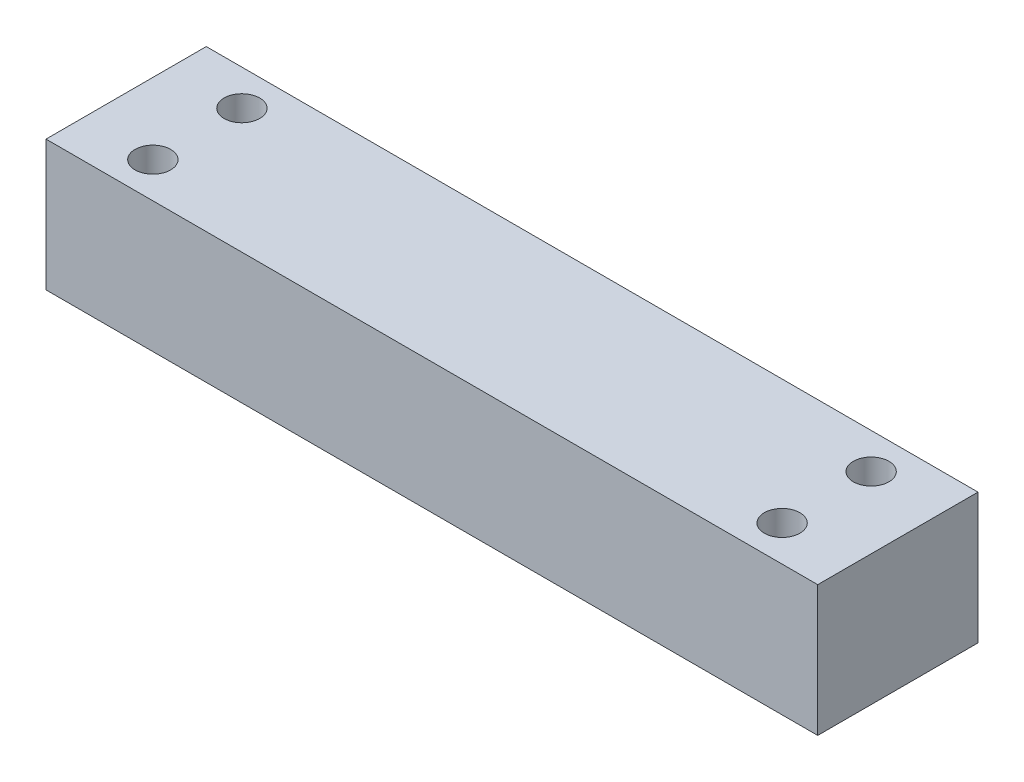
ISO-10303-21;
HEADER;
FILE_DESCRIPTION(('STEP AP214'),'2;1');
FILE_NAME('part.step','',(''),(''),'','','');
FILE_SCHEMA(('AUTOMOTIVE_DESIGN { 1 0 10303 214 1 1 1 1 }'));
ENDSEC;
DATA;
#1=APPLICATION_CONTEXT('core data for automotive mechanical design processes');
#2=APPLICATION_PROTOCOL_DEFINITION('international standard','automotive_design',2000,#1);
#3=PRODUCT_CONTEXT('',#1,'mechanical');
#4=PRODUCT('Part','Part','',(#3));
#5=PRODUCT_RELATED_PRODUCT_CATEGORY('part','',(#4));
#6=PRODUCT_DEFINITION_FORMATION('','',#4);
#7=PRODUCT_DEFINITION_CONTEXT('part definition',#1,'design');
#8=PRODUCT_DEFINITION('design','',#6,#7);
#9=PRODUCT_DEFINITION_SHAPE('','',#8);
#10=(LENGTH_UNIT() NAMED_UNIT(*) SI_UNIT(.MILLI.,.METRE.));
#11=(NAMED_UNIT(*) PLANE_ANGLE_UNIT() SI_UNIT($,.RADIAN.));
#12=(NAMED_UNIT(*) SI_UNIT($,.STERADIAN.) SOLID_ANGLE_UNIT());
#13=UNCERTAINTY_MEASURE_WITH_UNIT(LENGTH_MEASURE(1.E-05),#10,'distance_accuracy_value','');
#14=(GEOMETRIC_REPRESENTATION_CONTEXT(3) GLOBAL_UNCERTAINTY_ASSIGNED_CONTEXT((#13)) GLOBAL_UNIT_ASSIGNED_CONTEXT((#10,
#11,#12)) REPRESENTATION_CONTEXT('',''));
#15=CARTESIAN_POINT('',(0.,0.,0.));
#16=DIRECTION('',(0.,0.,1.));
#17=DIRECTION('',(1.,0.,0.));
#18=AXIS2_PLACEMENT_3D('',#15,#16,#17);
#19=CARTESIAN_POINT('',(0.,22.,0.));
#20=DIRECTION('',(0.,1.,0.));
#21=DIRECTION('',(0.,0.,1.));
#22=AXIS2_PLACEMENT_3D('',#19,#20,#21);
#23=PLANE('',#22);
#24=CARTESIAN_POINT('',(-53.,22.,-7.49999999999926));
#25=DIRECTION('',(0.,1.,0.));
#26=DIRECTION('',(0.,0.,1.));
#27=AXIS2_PLACEMENT_3D('',#24,#25,#26);
#28=CIRCLE('',#27,3.);
#29=CARTESIAN_POINT('',(-53.,22.,-4.49999999999926));
#30=VERTEX_POINT('',#29);
#31=EDGE_CURVE('E121',#30,#30,#28,.T.);
#32=ORIENTED_EDGE('',*,*,#31,.F.);
#33=EDGE_LOOP('',(#32));
#34=FACE_BOUND('',#33,.T.);
#35=CARTESIAN_POINT('',(53.,22.,-7.5));
#36=DIRECTION('',(0.,1.,0.));
#37=DIRECTION('',(0.,0.,1.));
#38=AXIS2_PLACEMENT_3D('',#35,#36,#37);
#39=CIRCLE('',#38,3.);
#40=CARTESIAN_POINT('',(53.,22.,-4.5));
#41=VERTEX_POINT('',#40);
#42=EDGE_CURVE('E100',#41,#41,#39,.T.);
#43=ORIENTED_EDGE('',*,*,#42,.F.);
#44=EDGE_LOOP('',(#43));
#45=FACE_BOUND('',#44,.T.);
#46=DIRECTION('',(0.,0.,1.));
#47=VECTOR('',#46,1.);
#48=CARTESIAN_POINT('',(-65.,22.,-13.5));
#49=LINE('',#48,#47);
#50=CARTESIAN_POINT('',(-65.,22.,-13.5));
#51=VERTEX_POINT('',#50);
#52=CARTESIAN_POINT('',(-65.,22.,13.5));
#53=VERTEX_POINT('',#52);
#54=EDGE_CURVE('E85',#51,#53,#49,.T.);
#55=ORIENTED_EDGE('',*,*,#54,.T.);
#56=DIRECTION('',(1.,0.,0.));
#57=VECTOR('',#56,1.);
#58=CARTESIAN_POINT('',(-65.,22.,13.5));
#59=LINE('',#58,#57);
#60=CARTESIAN_POINT('',(65.,22.,13.5));
#61=VERTEX_POINT('',#60);
#62=EDGE_CURVE('E80',#53,#61,#59,.T.);
#63=ORIENTED_EDGE('',*,*,#62,.T.);
#64=DIRECTION('',(0.,0.,-1.));
#65=VECTOR('',#64,1.);
#66=CARTESIAN_POINT('',(65.,22.,-13.5));
#67=LINE('',#66,#65);
#68=CARTESIAN_POINT('',(65.,22.,-13.5));
#69=VERTEX_POINT('',#68);
#70=EDGE_CURVE('E83',#61,#69,#67,.T.);
#71=ORIENTED_EDGE('',*,*,#70,.T.);
#72=DIRECTION('',(-1.,0.,0.));
#73=VECTOR('',#72,1.);
#74=CARTESIAN_POINT('',(-65.,22.,-13.5));
#75=LINE('',#74,#73);
#76=EDGE_CURVE('E50',#69,#51,#75,.T.);
#77=ORIENTED_EDGE('',*,*,#76,.T.);
#78=EDGE_LOOP('',(#55,#63,#71,#77));
#79=FACE_BOUND('',#78,.T.);
#80=CARTESIAN_POINT('',(53.,22.,7.5));
#81=DIRECTION('',(0.,1.,0.));
#82=DIRECTION('',(0.,0.,1.));
#83=AXIS2_PLACEMENT_3D('',#80,#81,#82);
#84=CIRCLE('',#83,3.);
#85=CARTESIAN_POINT('',(53.,22.,10.5));
#86=VERTEX_POINT('',#85);
#87=EDGE_CURVE('E115',#86,#86,#84,.T.);
#88=ORIENTED_EDGE('',*,*,#87,.F.);
#89=EDGE_LOOP('',(#88));
#90=FACE_BOUND('',#89,.T.);
#91=CARTESIAN_POINT('',(-53.,22.,7.50000000000074));
#92=DIRECTION('',(0.,1.,0.));
#93=DIRECTION('',(0.,0.,1.));
#94=AXIS2_PLACEMENT_3D('',#91,#92,#93);
#95=CIRCLE('',#94,3.);
#96=CARTESIAN_POINT('',(-53.,22.,10.5000000000007));
#97=VERTEX_POINT('',#96);
#98=EDGE_CURVE('E127',#97,#97,#95,.T.);
#99=ORIENTED_EDGE('',*,*,#98,.F.);
#100=EDGE_LOOP('',(#99));
#101=FACE_BOUND('',#100,.T.);
#102=ADVANCED_FACE('F33',(#34,#45,#79,#90,#101),#23,.T.);
#103=CARTESIAN_POINT('',(0.,0.,0.));
#104=DIRECTION('',(0.,1.,0.));
#105=DIRECTION('',(0.,0.,1.));
#106=AXIS2_PLACEMENT_3D('',#103,#104,#105);
#107=PLANE('',#106);
#108=DIRECTION('',(0.,0.,1.));
#109=VECTOR('',#108,1.);
#110=CARTESIAN_POINT('',(-65.,0.,-13.5));
#111=LINE('',#110,#109);
#112=CARTESIAN_POINT('',(-65.,0.,-13.5));
#113=VERTEX_POINT('',#112);
#114=CARTESIAN_POINT('',(-65.,0.,13.5));
#115=VERTEX_POINT('',#114);
#116=EDGE_CURVE('E97',#113,#115,#111,.T.);
#117=ORIENTED_EDGE('',*,*,#116,.F.);
#118=DIRECTION('',(-1.,0.,0.));
#119=VECTOR('',#118,1.);
#120=CARTESIAN_POINT('',(-65.,0.,-13.5));
#121=LINE('',#120,#119);
#122=CARTESIAN_POINT('',(65.,0.,-13.5));
#123=VERTEX_POINT('',#122);
#124=EDGE_CURVE('E73',#123,#113,#121,.T.);
#125=ORIENTED_EDGE('',*,*,#124,.F.);
#126=DIRECTION('',(0.,0.,-1.));
#127=VECTOR('',#126,1.);
#128=CARTESIAN_POINT('',(65.,0.,-13.5));
#129=LINE('',#128,#127);
#130=CARTESIAN_POINT('',(65.,0.,13.5));
#131=VERTEX_POINT('',#130);
#132=EDGE_CURVE('E67',#131,#123,#129,.T.);
#133=ORIENTED_EDGE('',*,*,#132,.F.);
#134=DIRECTION('',(1.,0.,0.));
#135=VECTOR('',#134,1.);
#136=CARTESIAN_POINT('',(-65.,0.,13.5));
#137=LINE('',#136,#135);
#138=EDGE_CURVE('E89',#115,#131,#137,.T.);
#139=ORIENTED_EDGE('',*,*,#138,.F.);
#140=EDGE_LOOP('',(#117,#125,#133,#139));
#141=FACE_BOUND('',#140,.T.);
#142=CARTESIAN_POINT('',(53.,0.,-7.5));
#143=DIRECTION('',(0.,1.,0.));
#144=DIRECTION('',(0.,0.,1.));
#145=AXIS2_PLACEMENT_3D('',#142,#143,#144);
#146=CIRCLE('',#145,3.);
#147=CARTESIAN_POINT('',(53.,0.,-4.5));
#148=VERTEX_POINT('',#147);
#149=EDGE_CURVE('E112',#148,#148,#146,.T.);
#150=ORIENTED_EDGE('',*,*,#149,.T.);
#151=EDGE_LOOP('',(#150));
#152=FACE_BOUND('',#151,.T.);
#153=CARTESIAN_POINT('',(53.,0.,7.5));
#154=DIRECTION('',(0.,1.,0.));
#155=DIRECTION('',(0.,0.,1.));
#156=AXIS2_PLACEMENT_3D('',#153,#154,#155);
#157=CIRCLE('',#156,3.);
#158=CARTESIAN_POINT('',(53.,0.,10.5));
#159=VERTEX_POINT('',#158);
#160=EDGE_CURVE('E118',#159,#159,#157,.T.);
#161=ORIENTED_EDGE('',*,*,#160,.T.);
#162=EDGE_LOOP('',(#161));
#163=FACE_BOUND('',#162,.T.);
#164=CARTESIAN_POINT('',(-53.,0.,-7.49999999999926));
#165=DIRECTION('',(0.,1.,0.));
#166=DIRECTION('',(0.,0.,1.));
#167=AXIS2_PLACEMENT_3D('',#164,#165,#166);
#168=CIRCLE('',#167,3.);
#169=CARTESIAN_POINT('',(-53.,0.,-4.49999999999926));
#170=VERTEX_POINT('',#169);
#171=EDGE_CURVE('E124',#170,#170,#168,.T.);
#172=ORIENTED_EDGE('',*,*,#171,.T.);
#173=EDGE_LOOP('',(#172));
#174=FACE_BOUND('',#173,.T.);
#175=CARTESIAN_POINT('',(-53.,0.,7.50000000000074));
#176=DIRECTION('',(0.,1.,0.));
#177=DIRECTION('',(0.,0.,1.));
#178=AXIS2_PLACEMENT_3D('',#175,#176,#177);
#179=CIRCLE('',#178,3.);
#180=CARTESIAN_POINT('',(-53.,0.,10.5000000000007));
#181=VERTEX_POINT('',#180);
#182=EDGE_CURVE('E130',#181,#181,#179,.T.);
#183=ORIENTED_EDGE('',*,*,#182,.T.);
#184=EDGE_LOOP('',(#183));
#185=FACE_BOUND('',#184,.T.);
#186=ADVANCED_FACE('F108',(#141,#152,#163,#174,#185),#107,.F.);
#187=CARTESIAN_POINT('',(-65.,22.,-13.5));
#188=DIRECTION('',(1.,0.,0.));
#189=DIRECTION('',(0.,0.,-1.));
#190=AXIS2_PLACEMENT_3D('',#187,#188,#189);
#191=PLANE('',#190);
#192=ORIENTED_EDGE('',*,*,#116,.T.);
#193=DIRECTION('',(0.,-1.,0.));
#194=VECTOR('',#193,1.);
#195=CARTESIAN_POINT('',(-65.,22.,13.5));
#196=LINE('',#195,#194);
#197=EDGE_CURVE('E11',#53,#115,#196,.T.);
#198=ORIENTED_EDGE('',*,*,#197,.F.);
#199=ORIENTED_EDGE('',*,*,#54,.F.);
#200=DIRECTION('',(0.,-1.,0.));
#201=VECTOR('',#200,1.);
#202=CARTESIAN_POINT('',(-65.,22.,-13.5));
#203=LINE('',#202,#201);
#204=EDGE_CURVE('E93',#51,#113,#203,.T.);
#205=ORIENTED_EDGE('',*,*,#204,.T.);
#206=EDGE_LOOP('',(#192,#198,#199,#205));
#207=FACE_BOUND('',#206,.T.);
#208=ADVANCED_FACE('F35',(#207),#191,.F.);
#209=CARTESIAN_POINT('',(-65.,22.,13.5));
#210=DIRECTION('',(0.,0.,-1.));
#211=DIRECTION('',(-1.,0.,0.));
#212=AXIS2_PLACEMENT_3D('',#209,#210,#211);
#213=PLANE('',#212);
#214=ORIENTED_EDGE('',*,*,#138,.T.);
#215=DIRECTION('',(0.,-1.,0.));
#216=VECTOR('',#215,1.);
#217=CARTESIAN_POINT('',(65.,22.,13.5));
#218=LINE('',#217,#216);
#219=EDGE_CURVE('E42',#61,#131,#218,.T.);
#220=ORIENTED_EDGE('',*,*,#219,.F.);
#221=ORIENTED_EDGE('',*,*,#62,.F.);
#222=ORIENTED_EDGE('',*,*,#197,.T.);
#223=EDGE_LOOP('',(#214,#220,#221,#222));
#224=FACE_BOUND('',#223,.T.);
#225=ADVANCED_FACE('F88',(#224),#213,.F.);
#226=CARTESIAN_POINT('',(65.,22.,-13.5));
#227=DIRECTION('',(-1.,0.,0.));
#228=DIRECTION('',(0.,0.,1.));
#229=AXIS2_PLACEMENT_3D('',#226,#227,#228);
#230=PLANE('',#229);
#231=ORIENTED_EDGE('',*,*,#132,.T.);
#232=DIRECTION('',(0.,-1.,0.));
#233=VECTOR('',#232,1.);
#234=CARTESIAN_POINT('',(65.,22.,-13.5));
#235=LINE('',#234,#233);
#236=EDGE_CURVE('E90',#69,#123,#235,.T.);
#237=ORIENTED_EDGE('',*,*,#236,.F.);
#238=ORIENTED_EDGE('',*,*,#70,.F.);
#239=ORIENTED_EDGE('',*,*,#219,.T.);
#240=EDGE_LOOP('',(#231,#237,#238,#239));
#241=FACE_BOUND('',#240,.T.);
#242=ADVANCED_FACE('F91',(#241),#230,.F.);
#243=CARTESIAN_POINT('',(-65.,22.,-13.5));
#244=DIRECTION('',(0.,0.,1.));
#245=DIRECTION('',(1.,0.,0.));
#246=AXIS2_PLACEMENT_3D('',#243,#244,#245);
#247=PLANE('',#246);
#248=ORIENTED_EDGE('',*,*,#124,.T.);
#249=ORIENTED_EDGE('',*,*,#204,.F.);
#250=ORIENTED_EDGE('',*,*,#76,.F.);
#251=ORIENTED_EDGE('',*,*,#236,.T.);
#252=EDGE_LOOP('',(#248,#249,#250,#251));
#253=FACE_BOUND('',#252,.T.);
#254=ADVANCED_FACE('F105',(#253),#247,.F.);
#255=CARTESIAN_POINT('',(53.,22.,-7.5));
#256=DIRECTION('',(0.,-1.,0.));
#257=DIRECTION('',(0.,0.,-1.));
#258=AXIS2_PLACEMENT_3D('',#255,#256,#257);
#259=CYLINDRICAL_SURFACE('',#258,3.);
#260=ORIENTED_EDGE('',*,*,#42,.T.);
#261=EDGE_LOOP('',(#260));
#262=FACE_BOUND('',#261,.T.);
#263=ORIENTED_EDGE('',*,*,#149,.F.);
#264=EDGE_LOOP('',(#263));
#265=FACE_BOUND('',#264,.T.);
#266=ADVANCED_FACE('F149',(#262,#265),#259,.F.);
#267=CARTESIAN_POINT('',(53.,22.,7.5));
#268=DIRECTION('',(0.,-1.,0.));
#269=DIRECTION('',(0.,0.,-1.));
#270=AXIS2_PLACEMENT_3D('',#267,#268,#269);
#271=CYLINDRICAL_SURFACE('',#270,3.);
#272=ORIENTED_EDGE('',*,*,#87,.T.);
#273=EDGE_LOOP('',(#272));
#274=FACE_BOUND('',#273,.T.);
#275=ORIENTED_EDGE('',*,*,#160,.F.);
#276=EDGE_LOOP('',(#275));
#277=FACE_BOUND('',#276,.T.);
#278=ADVANCED_FACE('F195',(#274,#277),#271,.F.);
#279=CARTESIAN_POINT('',(-53.,22.,-7.49999999999926));
#280=DIRECTION('',(0.,-1.,0.));
#281=DIRECTION('',(0.,0.,-1.));
#282=AXIS2_PLACEMENT_3D('',#279,#280,#281);
#283=CYLINDRICAL_SURFACE('',#282,3.);
#284=ORIENTED_EDGE('',*,*,#31,.T.);
#285=EDGE_LOOP('',(#284));
#286=FACE_BOUND('',#285,.T.);
#287=ORIENTED_EDGE('',*,*,#171,.F.);
#288=EDGE_LOOP('',(#287));
#289=FACE_BOUND('',#288,.T.);
#290=ADVANCED_FACE('F203',(#286,#289),#283,.F.);
#291=CARTESIAN_POINT('',(-53.,22.,7.50000000000074));
#292=DIRECTION('',(0.,-1.,0.));
#293=DIRECTION('',(0.,0.,-1.));
#294=AXIS2_PLACEMENT_3D('',#291,#292,#293);
#295=CYLINDRICAL_SURFACE('',#294,3.);
#296=ORIENTED_EDGE('',*,*,#98,.T.);
#297=EDGE_LOOP('',(#296));
#298=FACE_BOUND('',#297,.T.);
#299=ORIENTED_EDGE('',*,*,#182,.F.);
#300=EDGE_LOOP('',(#299));
#301=FACE_BOUND('',#300,.T.);
#302=ADVANCED_FACE('F136',(#298,#301),#295,.F.);
#303=CLOSED_SHELL('',(#102,#186,#208,#225,#242,#254,#266,#278,#290,#302));
#304=MANIFOLD_SOLID_BREP('B2',#303);
#305=ADVANCED_BREP_SHAPE_REPRESENTATION('',(#18,#304),#14);
#306=SHAPE_DEFINITION_REPRESENTATION(#9,#305);
ENDSEC;
END-ISO-10303-21;
